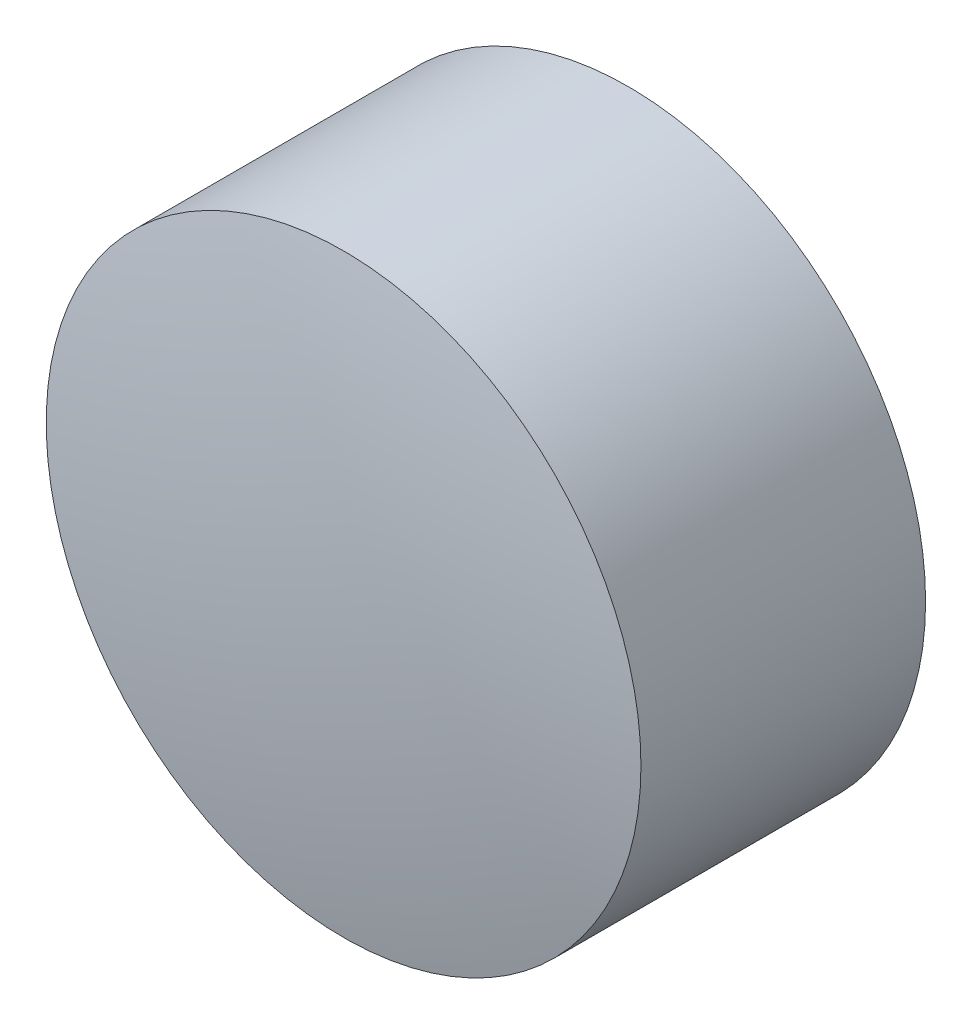
ISO-10303-21;
HEADER;
FILE_DESCRIPTION(('STEP AP214'),'2;1');
FILE_NAME('part.step','',(''),(''),'','','');
FILE_SCHEMA(('AUTOMOTIVE_DESIGN { 1 0 10303 214 1 1 1 1 }'));
ENDSEC;
DATA;
#1=APPLICATION_CONTEXT('core data for automotive mechanical design processes');
#2=APPLICATION_PROTOCOL_DEFINITION('international standard','automotive_design',2000,#1);
#3=PRODUCT_CONTEXT('',#1,'mechanical');
#4=PRODUCT('Part','Part','',(#3));
#5=PRODUCT_RELATED_PRODUCT_CATEGORY('part','',(#4));
#6=PRODUCT_DEFINITION_FORMATION('','',#4);
#7=PRODUCT_DEFINITION_CONTEXT('part definition',#1,'design');
#8=PRODUCT_DEFINITION('design','',#6,#7);
#9=PRODUCT_DEFINITION_SHAPE('','',#8);
#10=(LENGTH_UNIT() NAMED_UNIT(*) SI_UNIT(.MILLI.,.METRE.));
#11=(NAMED_UNIT(*) PLANE_ANGLE_UNIT() SI_UNIT($,.RADIAN.));
#12=(NAMED_UNIT(*) SI_UNIT($,.STERADIAN.) SOLID_ANGLE_UNIT());
#13=UNCERTAINTY_MEASURE_WITH_UNIT(LENGTH_MEASURE(1.E-05),#10,'distance_accuracy_value','');
#14=(GEOMETRIC_REPRESENTATION_CONTEXT(3) GLOBAL_UNCERTAINTY_ASSIGNED_CONTEXT((#13)) GLOBAL_UNIT_ASSIGNED_CONTEXT((#10,
#11,#12)) REPRESENTATION_CONTEXT('',''));
#15=CARTESIAN_POINT('',(0.,0.,0.));
#16=DIRECTION('',(0.,0.,1.));
#17=DIRECTION('',(1.,0.,0.));
#18=AXIS2_PLACEMENT_3D('',#15,#16,#17);
#19=CARTESIAN_POINT('',(0.,0.,-4.88000000000002));
#20=DIRECTION('',(0.,-1.,0.));
#21=DIRECTION('',(0.,0.,1.));
#22=AXIS2_PLACEMENT_3D('',#19,#20,#21);
#23=SPHERICAL_SURFACE('',#22,7.88000000000002);
#24=CARTESIAN_POINT('',(0.,0.,2.85591623532727));
#25=DIRECTION('',(0.,0.,1.));
#26=DIRECTION('',(1.,0.,0.));
#27=AXIS2_PLACEMENT_3D('',#24,#25,#26);
#28=CIRCLE('',#27,1.5);
#29=CARTESIAN_POINT('',(1.5,0.,2.85591623532727));
#30=VERTEX_POINT('',#29);
#31=EDGE_CURVE('E18',#30,#30,#28,.F.);
#32=ORIENTED_EDGE('',*,*,#31,.F.);
#33=EDGE_LOOP('',(#32));
#34=FACE_BOUND('',#33,.T.);
#35=ADVANCED_FACE('F14',(#34),#23,.T.);
#36=CARTESIAN_POINT('',(0.,0.,-0.229999999999998));
#37=DIRECTION('',(0.,1.,0.));
#38=DIRECTION('',(0.,0.,1.));
#39=AXIS2_PLACEMENT_3D('',#36,#37,#38);
#40=SPHERICAL_SURFACE('',#39,2.23);
#41=CARTESIAN_POINT('',(0.,0.,1.4201212076693));
#42=DIRECTION('',(0.,0.,1.));
#43=DIRECTION('',(1.,0.,0.));
#44=AXIS2_PLACEMENT_3D('',#41,#42,#43);
#45=CIRCLE('',#44,1.5);
#46=CARTESIAN_POINT('',(1.5,0.,1.4201212076693));
#47=VERTEX_POINT('',#46);
#48=EDGE_CURVE('E10',#47,#47,#45,.T.);
#49=ORIENTED_EDGE('',*,*,#48,.F.);
#50=EDGE_LOOP('',(#49));
#51=FACE_BOUND('',#50,.T.);
#52=ADVANCED_FACE('F28',(#51),#40,.F.);
#53=CARTESIAN_POINT('',(0.,0.,1.4201212076693));
#54=DIRECTION('',(0.,0.,1.));
#55=DIRECTION('',(1.,0.,0.));
#56=AXIS2_PLACEMENT_3D('',#53,#54,#55);
#57=CYLINDRICAL_SURFACE('',#56,1.5);
#58=ORIENTED_EDGE('',*,*,#48,.T.);
#59=EDGE_LOOP('',(#58));
#60=FACE_BOUND('',#59,.T.);
#61=ORIENTED_EDGE('',*,*,#31,.T.);
#62=EDGE_LOOP('',(#61));
#63=FACE_BOUND('',#62,.T.);
#64=ADVANCED_FACE('F31',(#60,#63),#57,.T.);
#65=CLOSED_SHELL('',(#35,#52,#64));
#66=MANIFOLD_SOLID_BREP('B1',#65);
#67=ADVANCED_BREP_SHAPE_REPRESENTATION('',(#18,#66),#14);
#68=SHAPE_DEFINITION_REPRESENTATION(#9,#67);
ENDSEC;
END-ISO-10303-21;
